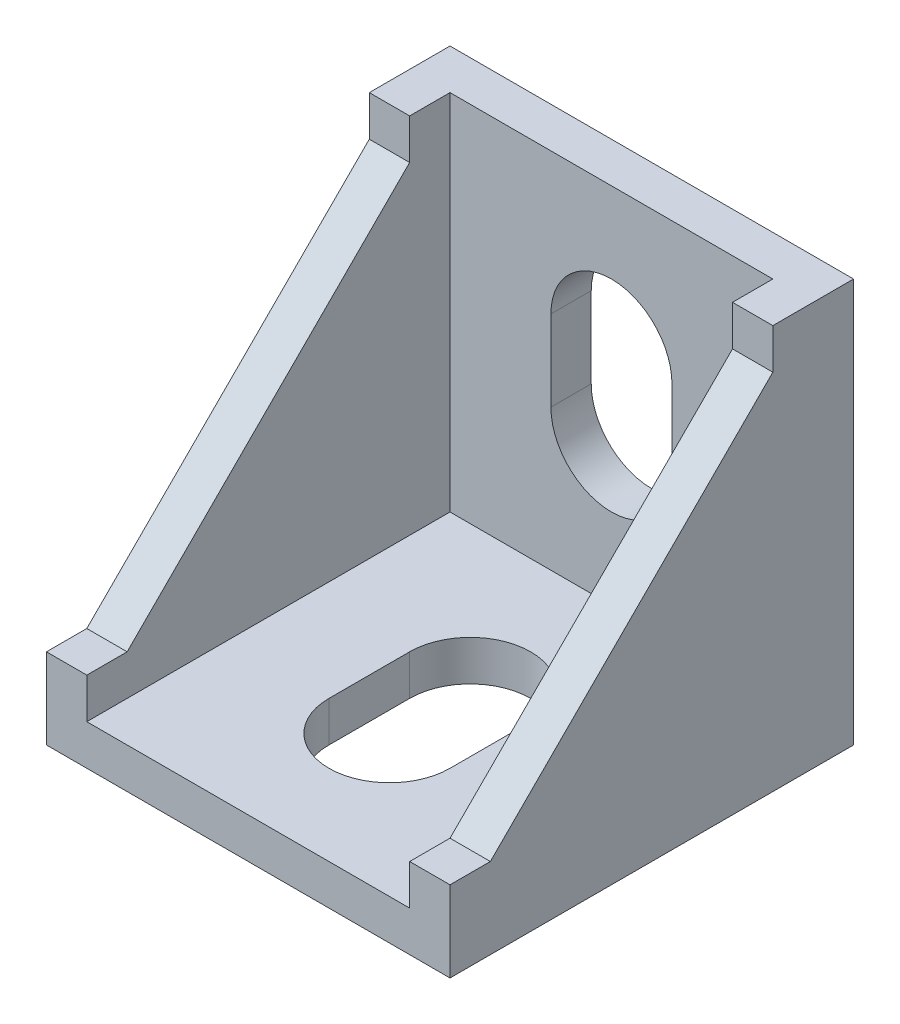
ISO-10303-21;
HEADER;
FILE_DESCRIPTION(('STEP AP214'),'2;1');
FILE_NAME('part.step','',(''),(''),'','','');
FILE_SCHEMA(('AUTOMOTIVE_DESIGN { 1 0 10303 214 1 1 1 1 }'));
ENDSEC;
DATA;
#1=APPLICATION_CONTEXT('core data for automotive mechanical design processes');
#2=APPLICATION_PROTOCOL_DEFINITION('international standard','automotive_design',2000,#1);
#3=PRODUCT_CONTEXT('',#1,'mechanical');
#4=PRODUCT('Part','Part','',(#3));
#5=PRODUCT_RELATED_PRODUCT_CATEGORY('part','',(#4));
#6=PRODUCT_DEFINITION_FORMATION('','',#4);
#7=PRODUCT_DEFINITION_CONTEXT('part definition',#1,'design');
#8=PRODUCT_DEFINITION('design','',#6,#7);
#9=PRODUCT_DEFINITION_SHAPE('','',#8);
#10=(LENGTH_UNIT() NAMED_UNIT(*) SI_UNIT(.MILLI.,.METRE.));
#11=(NAMED_UNIT(*) PLANE_ANGLE_UNIT() SI_UNIT($,.RADIAN.));
#12=(NAMED_UNIT(*) SI_UNIT($,.STERADIAN.) SOLID_ANGLE_UNIT());
#13=UNCERTAINTY_MEASURE_WITH_UNIT(LENGTH_MEASURE(1.E-05),#10,'distance_accuracy_value','');
#14=(GEOMETRIC_REPRESENTATION_CONTEXT(3) GLOBAL_UNCERTAINTY_ASSIGNED_CONTEXT((#13)) GLOBAL_UNIT_ASSIGNED_CONTEXT((#10,
#11,#12)) REPRESENTATION_CONTEXT('',''));
#15=CARTESIAN_POINT('',(0.,0.,0.));
#16=DIRECTION('',(0.,0.,1.));
#17=DIRECTION('',(1.,0.,0.));
#18=AXIS2_PLACEMENT_3D('',#15,#16,#17);
#19=CARTESIAN_POINT('',(0.,2.,0.));
#20=DIRECTION('',(0.,-1.,0.));
#21=DIRECTION('',(0.,0.,-1.));
#22=AXIS2_PLACEMENT_3D('',#19,#20,#21);
#23=PLANE('',#22);
#24=DIRECTION('',(0.,0.,-1.));
#25=VECTOR('',#24,1.);
#26=CARTESIAN_POINT('',(-3.,2.,0.));
#27=LINE('',#26,#25);
#28=CARTESIAN_POINT('',(-3.,2.,3.));
#29=VERTEX_POINT('',#28);
#30=CARTESIAN_POINT('',(-3.,2.,-1.));
#31=VERTEX_POINT('',#30);
#32=EDGE_CURVE('E230',#29,#31,#27,.T.);
#33=ORIENTED_EDGE('',*,*,#32,.T.);
#34=CARTESIAN_POINT('',(0.,2.,-1.));
#35=DIRECTION('',(0.,-1.,0.));
#36=DIRECTION('',(0.,0.,-1.));
#37=AXIS2_PLACEMENT_3D('',#34,#35,#36);
#38=CIRCLE('',#37,3.);
#39=CARTESIAN_POINT('',(3.,2.,-1.));
#40=VERTEX_POINT('',#39);
#41=EDGE_CURVE('E246',#31,#40,#38,.T.);
#42=ORIENTED_EDGE('',*,*,#41,.T.);
#43=DIRECTION('',(0.,0.,1.));
#44=VECTOR('',#43,1.);
#45=CARTESIAN_POINT('',(3.,2.,0.));
#46=LINE('',#45,#44);
#47=CARTESIAN_POINT('',(3.,2.,3.));
#48=VERTEX_POINT('',#47);
#49=EDGE_CURVE('E243',#40,#48,#46,.T.);
#50=ORIENTED_EDGE('',*,*,#49,.T.);
#51=CARTESIAN_POINT('',(0.,2.,3.));
#52=DIRECTION('',(0.,-1.,0.));
#53=DIRECTION('',(0.,0.,-1.));
#54=AXIS2_PLACEMENT_3D('',#51,#52,#53);
#55=CIRCLE('',#54,3.);
#56=EDGE_CURVE('E240',#48,#29,#55,.T.);
#57=ORIENTED_EDGE('',*,*,#56,.T.);
#58=EDGE_LOOP('',(#33,#42,#50,#57));
#59=FACE_BOUND('',#58,.T.);
#60=DIRECTION('',(1.,0.,0.));
#61=VECTOR('',#60,1.);
#62=CARTESIAN_POINT('',(-10.,2.,10.));
#63=LINE('',#62,#61);
#64=CARTESIAN_POINT('',(-8.,2.,10.));
#65=VERTEX_POINT('',#64);
#66=CARTESIAN_POINT('',(8.,2.,10.));
#67=VERTEX_POINT('',#66);
#68=EDGE_CURVE('E340',#65,#67,#63,.T.);
#69=ORIENTED_EDGE('',*,*,#68,.T.);
#70=DIRECTION('',(0.,0.,-1.));
#71=VECTOR('',#70,1.);
#72=CARTESIAN_POINT('',(8.,2.,10.));
#73=LINE('',#72,#71);
#74=CARTESIAN_POINT('',(8.,2.,-8.00000000000001));
#75=VERTEX_POINT('',#74);
#76=EDGE_CURVE('E259',#67,#75,#73,.T.);
#77=ORIENTED_EDGE('',*,*,#76,.T.);
#78=DIRECTION('',(1.,0.,0.));
#79=VECTOR('',#78,1.);
#80=CARTESIAN_POINT('',(0.,2.,-8.));
#81=LINE('',#80,#79);
#82=CARTESIAN_POINT('',(-8.,2.,-8.00000000000001));
#83=VERTEX_POINT('',#82);
#84=EDGE_CURVE('E334',#83,#75,#81,.T.);
#85=ORIENTED_EDGE('',*,*,#84,.F.);
#86=DIRECTION('',(0.,0.,-1.));
#87=VECTOR('',#86,1.);
#88=CARTESIAN_POINT('',(-8.,2.,10.));
#89=LINE('',#88,#87);
#90=EDGE_CURVE('E299',#65,#83,#89,.T.);
#91=ORIENTED_EDGE('',*,*,#90,.F.);
#92=EDGE_LOOP('',(#69,#77,#85,#91));
#93=FACE_BOUND('',#92,.T.);
#94=ADVANCED_FACE('F38',(#59,#93),#23,.F.);
#95=CARTESIAN_POINT('',(10.,2.,10.));
#96=DIRECTION('',(-1.,0.,0.));
#97=DIRECTION('',(0.,0.,1.));
#98=AXIS2_PLACEMENT_3D('',#95,#96,#97);
#99=PLANE('',#98);
#100=DIRECTION('',(0.,-1.,0.));
#101=VECTOR('',#100,1.);
#102=CARTESIAN_POINT('',(10.,2.,-10.));
#103=LINE('',#102,#101);
#104=CARTESIAN_POINT('',(10.,20.,-10.));
#105=VERTEX_POINT('',#104);
#106=CARTESIAN_POINT('',(10.,0.,-10.));
#107=VERTEX_POINT('',#106);
#108=EDGE_CURVE('E359',#105,#107,#103,.T.);
#109=ORIENTED_EDGE('',*,*,#108,.F.);
#110=DIRECTION('',(0.,0.,-1.));
#111=VECTOR('',#110,1.);
#112=CARTESIAN_POINT('',(10.,20.,-8.));
#113=LINE('',#112,#111);
#114=CARTESIAN_POINT('',(10.,20.,-6.));
#115=VERTEX_POINT('',#114);
#116=EDGE_CURVE('E331',#115,#105,#113,.T.);
#117=ORIENTED_EDGE('',*,*,#116,.F.);
#118=DIRECTION('',(0.,-1.,0.));
#119=VECTOR('',#118,1.);
#120=CARTESIAN_POINT('',(10.,20.,-6.));
#121=LINE('',#120,#119);
#122=CARTESIAN_POINT('',(10.,18.,-6.));
#123=VERTEX_POINT('',#122);
#124=EDGE_CURVE('E249',#115,#123,#121,.T.);
#125=ORIENTED_EDGE('',*,*,#124,.T.);
#126=DIRECTION('',(0.,-0.707106781186548,0.707106781186547));
#127=VECTOR('',#126,1.);
#128=CARTESIAN_POINT('',(10.,18.,-6.));
#129=LINE('',#128,#127);
#130=CARTESIAN_POINT('',(10.,4.,7.99999999999999));
#131=VERTEX_POINT('',#130);
#132=EDGE_CURVE('E254',#123,#131,#129,.T.);
#133=ORIENTED_EDGE('',*,*,#132,.T.);
#134=DIRECTION('',(0.,0.,-1.));
#135=VECTOR('',#134,1.);
#136=CARTESIAN_POINT('',(10.,4.,10.));
#137=LINE('',#136,#135);
#138=CARTESIAN_POINT('',(10.,4.,10.));
#139=VERTEX_POINT('',#138);
#140=EDGE_CURVE('E272',#139,#131,#137,.T.);
#141=ORIENTED_EDGE('',*,*,#140,.F.);
#142=DIRECTION('',(0.,-1.,0.));
#143=VECTOR('',#142,1.);
#144=CARTESIAN_POINT('',(10.,2.,10.));
#145=LINE('',#144,#143);
#146=CARTESIAN_POINT('',(10.,0.,10.));
#147=VERTEX_POINT('',#146);
#148=EDGE_CURVE('E343',#139,#147,#145,.T.);
#149=ORIENTED_EDGE('',*,*,#148,.T.);
#150=DIRECTION('',(0.,0.,-1.));
#151=VECTOR('',#150,1.);
#152=CARTESIAN_POINT('',(10.,0.,10.));
#153=LINE('',#152,#151);
#154=EDGE_CURVE('E339',#147,#107,#153,.T.);
#155=ORIENTED_EDGE('',*,*,#154,.T.);
#156=EDGE_LOOP('',(#109,#117,#125,#133,#141,#149,#155));
#157=FACE_BOUND('',#156,.T.);
#158=ADVANCED_FACE('F40',(#157),#99,.F.);
#159=CARTESIAN_POINT('',(-10.,2.,-10.));
#160=DIRECTION('',(0.,0.,1.));
#161=DIRECTION('',(1.,0.,0.));
#162=AXIS2_PLACEMENT_3D('',#159,#160,#161);
#163=PLANE('',#162);
#164=DIRECTION('',(0.,1.,0.));
#165=VECTOR('',#164,1.);
#166=CARTESIAN_POINT('',(3.,13.,-10.));
#167=LINE('',#166,#165);
#168=CARTESIAN_POINT('',(3.,9.,-10.));
#169=VERTEX_POINT('',#168);
#170=CARTESIAN_POINT('',(3.,13.,-10.));
#171=VERTEX_POINT('',#170);
#172=EDGE_CURVE('E194',#169,#171,#167,.T.);
#173=ORIENTED_EDGE('',*,*,#172,.T.);
#174=CARTESIAN_POINT('',(0.,13.,-10.));
#175=DIRECTION('',(0.,0.,1.));
#176=DIRECTION('',(1.,0.,0.));
#177=AXIS2_PLACEMENT_3D('',#174,#175,#176);
#178=CIRCLE('',#177,3.);
#179=CARTESIAN_POINT('',(-3.,13.,-10.));
#180=VERTEX_POINT('',#179);
#181=EDGE_CURVE('E190',#171,#180,#178,.T.);
#182=ORIENTED_EDGE('',*,*,#181,.T.);
#183=DIRECTION('',(0.,-1.,0.));
#184=VECTOR('',#183,1.);
#185=CARTESIAN_POINT('',(-3.,13.,-10.));
#186=LINE('',#185,#184);
#187=CARTESIAN_POINT('',(-3.,9.,-10.));
#188=VERTEX_POINT('',#187);
#189=EDGE_CURVE('E197',#180,#188,#186,.T.);
#190=ORIENTED_EDGE('',*,*,#189,.T.);
#191=CARTESIAN_POINT('',(0.,9.,-10.));
#192=DIRECTION('',(0.,0.,1.));
#193=DIRECTION('',(1.,0.,0.));
#194=AXIS2_PLACEMENT_3D('',#191,#192,#193);
#195=CIRCLE('',#194,3.);
#196=EDGE_CURVE('E53',#188,#169,#195,.T.);
#197=ORIENTED_EDGE('',*,*,#196,.T.);
#198=EDGE_LOOP('',(#173,#182,#190,#197));
#199=FACE_BOUND('',#198,.T.);
#200=DIRECTION('',(-1.,0.,0.));
#201=VECTOR('',#200,1.);
#202=CARTESIAN_POINT('',(-10.,0.,-10.));
#203=LINE('',#202,#201);
#204=CARTESIAN_POINT('',(-10.,0.,-10.));
#205=VERTEX_POINT('',#204);
#206=EDGE_CURVE('E346',#107,#205,#203,.T.);
#207=ORIENTED_EDGE('',*,*,#206,.T.);
#208=DIRECTION('',(0.,-1.,0.));
#209=VECTOR('',#208,1.);
#210=CARTESIAN_POINT('',(-10.,2.,-10.));
#211=LINE('',#210,#209);
#212=CARTESIAN_POINT('',(-10.,20.,-10.));
#213=VERTEX_POINT('',#212);
#214=EDGE_CURVE('E356',#213,#205,#211,.T.);
#215=ORIENTED_EDGE('',*,*,#214,.F.);
#216=DIRECTION('',(1.,0.,0.));
#217=VECTOR('',#216,1.);
#218=CARTESIAN_POINT('',(-10.,20.,-10.));
#219=LINE('',#218,#217);
#220=EDGE_CURVE('E324',#213,#105,#219,.T.);
#221=ORIENTED_EDGE('',*,*,#220,.T.);
#222=ORIENTED_EDGE('',*,*,#108,.T.);
#223=EDGE_LOOP('',(#207,#215,#221,#222));
#224=FACE_BOUND('',#223,.T.);
#225=ADVANCED_FACE('F201',(#199,#224),#163,.F.);
#226=CARTESIAN_POINT('',(-10.,2.,10.));
#227=DIRECTION('',(1.,0.,0.));
#228=DIRECTION('',(0.,0.,-1.));
#229=AXIS2_PLACEMENT_3D('',#226,#227,#228);
#230=PLANE('',#229);
#231=DIRECTION('',(0.,-1.,0.));
#232=VECTOR('',#231,1.);
#233=CARTESIAN_POINT('',(-10.,2.,10.));
#234=LINE('',#233,#232);
#235=CARTESIAN_POINT('',(-10.,4.,10.));
#236=VERTEX_POINT('',#235);
#237=CARTESIAN_POINT('',(-10.,0.,10.));
#238=VERTEX_POINT('',#237);
#239=EDGE_CURVE('E353',#236,#238,#234,.T.);
#240=ORIENTED_EDGE('',*,*,#239,.F.);
#241=DIRECTION('',(0.,0.,-1.));
#242=VECTOR('',#241,1.);
#243=CARTESIAN_POINT('',(-10.,4.,10.));
#244=LINE('',#243,#242);
#245=CARTESIAN_POINT('',(-10.,4.,7.99999999999999));
#246=VERTEX_POINT('',#245);
#247=EDGE_CURVE('E291',#236,#246,#244,.T.);
#248=ORIENTED_EDGE('',*,*,#247,.T.);
#249=DIRECTION('',(0.,-0.707106781186548,0.707106781186547));
#250=VECTOR('',#249,1.);
#251=CARTESIAN_POINT('',(-10.,18.,-6.));
#252=LINE('',#251,#250);
#253=CARTESIAN_POINT('',(-10.,18.,-6.));
#254=VERTEX_POINT('',#253);
#255=EDGE_CURVE('E309',#254,#246,#252,.T.);
#256=ORIENTED_EDGE('',*,*,#255,.F.);
#257=DIRECTION('',(0.,-1.,0.));
#258=VECTOR('',#257,1.);
#259=CARTESIAN_POINT('',(-10.,20.,-6.));
#260=LINE('',#259,#258);
#261=CARTESIAN_POINT('',(-10.,20.,-6.));
#262=VERTEX_POINT('',#261);
#263=EDGE_CURVE('E286',#262,#254,#260,.T.);
#264=ORIENTED_EDGE('',*,*,#263,.F.);
#265=DIRECTION('',(0.,0.,-1.));
#266=VECTOR('',#265,1.);
#267=CARTESIAN_POINT('',(-10.,20.,-8.));
#268=LINE('',#267,#266);
#269=EDGE_CURVE('E328',#262,#213,#268,.T.);
#270=ORIENTED_EDGE('',*,*,#269,.T.);
#271=ORIENTED_EDGE('',*,*,#214,.T.);
#272=DIRECTION('',(0.,0.,1.));
#273=VECTOR('',#272,1.);
#274=CARTESIAN_POINT('',(-10.,0.,10.));
#275=LINE('',#274,#273);
#276=EDGE_CURVE('E348',#205,#238,#275,.T.);
#277=ORIENTED_EDGE('',*,*,#276,.T.);
#278=EDGE_LOOP('',(#240,#248,#256,#264,#270,#271,#277));
#279=FACE_BOUND('',#278,.T.);
#280=ADVANCED_FACE('F400',(#279),#230,.F.);
#281=CARTESIAN_POINT('',(-10.,2.,10.));
#282=DIRECTION('',(0.,0.,-1.));
#283=DIRECTION('',(-1.,0.,0.));
#284=AXIS2_PLACEMENT_3D('',#281,#282,#283);
#285=PLANE('',#284);
#286=DIRECTION('',(1.,0.,0.));
#287=VECTOR('',#286,1.);
#288=CARTESIAN_POINT('',(-10.,0.,10.));
#289=LINE('',#288,#287);
#290=EDGE_CURVE('E344',#238,#147,#289,.T.);
#291=ORIENTED_EDGE('',*,*,#290,.T.);
#292=ORIENTED_EDGE('',*,*,#148,.F.);
#293=DIRECTION('',(1.,0.,0.));
#294=VECTOR('',#293,1.);
#295=CARTESIAN_POINT('',(8.,4.,10.));
#296=LINE('',#295,#294);
#297=CARTESIAN_POINT('',(8.,4.,10.));
#298=VERTEX_POINT('',#297);
#299=EDGE_CURVE('E280',#298,#139,#296,.T.);
#300=ORIENTED_EDGE('',*,*,#299,.F.);
#301=DIRECTION('',(0.,1.,0.));
#302=VECTOR('',#301,1.);
#303=CARTESIAN_POINT('',(8.,2.,10.));
#304=LINE('',#303,#302);
#305=EDGE_CURVE('E262',#67,#298,#304,.T.);
#306=ORIENTED_EDGE('',*,*,#305,.F.);
#307=ORIENTED_EDGE('',*,*,#68,.F.);
#308=DIRECTION('',(0.,1.,0.));
#309=VECTOR('',#308,1.);
#310=CARTESIAN_POINT('',(-8.,2.,10.));
#311=LINE('',#310,#309);
#312=CARTESIAN_POINT('',(-8.,4.,10.));
#313=VERTEX_POINT('',#312);
#314=EDGE_CURVE('E296',#65,#313,#311,.T.);
#315=ORIENTED_EDGE('',*,*,#314,.T.);
#316=DIRECTION('',(-1.,0.,0.));
#317=VECTOR('',#316,1.);
#318=CARTESIAN_POINT('',(-8.,4.,10.));
#319=LINE('',#318,#317);
#320=EDGE_CURVE('E316',#313,#236,#319,.T.);
#321=ORIENTED_EDGE('',*,*,#320,.T.);
#322=ORIENTED_EDGE('',*,*,#239,.T.);
#323=EDGE_LOOP('',(#291,#292,#300,#306,#307,#315,#321,#322));
#324=FACE_BOUND('',#323,.T.);
#325=ADVANCED_FACE('F396',(#324),#285,.F.);
#326=CARTESIAN_POINT('',(0.,0.,0.));
#327=DIRECTION('',(0.,-1.,0.));
#328=DIRECTION('',(0.,0.,-1.));
#329=AXIS2_PLACEMENT_3D('',#326,#327,#328);
#330=PLANE('',#329);
#331=CARTESIAN_POINT('',(0.,0.,-1.));
#332=DIRECTION('',(0.,1.,0.));
#333=DIRECTION('',(0.,0.,1.));
#334=AXIS2_PLACEMENT_3D('',#331,#332,#333);
#335=CIRCLE('',#334,3.);
#336=CARTESIAN_POINT('',(3.,0.,-1.));
#337=VERTEX_POINT('',#336);
#338=CARTESIAN_POINT('',(-3.,0.,-1.));
#339=VERTEX_POINT('',#338);
#340=EDGE_CURVE('E210',#337,#339,#335,.T.);
#341=ORIENTED_EDGE('',*,*,#340,.T.);
#342=DIRECTION('',(0.,0.,1.));
#343=VECTOR('',#342,1.);
#344=CARTESIAN_POINT('',(-3.,0.,-1.));
#345=LINE('',#344,#343);
#346=CARTESIAN_POINT('',(-3.,0.,3.));
#347=VERTEX_POINT('',#346);
#348=EDGE_CURVE('E217',#339,#347,#345,.T.);
#349=ORIENTED_EDGE('',*,*,#348,.T.);
#350=CARTESIAN_POINT('',(0.,0.,3.));
#351=DIRECTION('',(0.,1.,0.));
#352=DIRECTION('',(0.,0.,1.));
#353=AXIS2_PLACEMENT_3D('',#350,#351,#352);
#354=CIRCLE('',#353,3.);
#355=CARTESIAN_POINT('',(3.,0.,3.));
#356=VERTEX_POINT('',#355);
#357=EDGE_CURVE('E220',#347,#356,#354,.T.);
#358=ORIENTED_EDGE('',*,*,#357,.T.);
#359=DIRECTION('',(0.,0.,-1.));
#360=VECTOR('',#359,1.);
#361=CARTESIAN_POINT('',(3.,0.,-1.));
#362=LINE('',#361,#360);
#363=EDGE_CURVE('E223',#356,#337,#362,.T.);
#364=ORIENTED_EDGE('',*,*,#363,.T.);
#365=EDGE_LOOP('',(#341,#349,#358,#364));
#366=FACE_BOUND('',#365,.T.);
#367=ORIENTED_EDGE('',*,*,#206,.F.);
#368=ORIENTED_EDGE('',*,*,#154,.F.);
#369=ORIENTED_EDGE('',*,*,#290,.F.);
#370=ORIENTED_EDGE('',*,*,#276,.F.);
#371=EDGE_LOOP('',(#367,#368,#369,#370));
#372=FACE_BOUND('',#371,.T.);
#373=ADVANCED_FACE('F393',(#366,#372),#330,.T.);
#374=CARTESIAN_POINT('',(0.,0.,-8.));
#375=DIRECTION('',(0.,0.,-1.));
#376=DIRECTION('',(-1.,0.,0.));
#377=AXIS2_PLACEMENT_3D('',#374,#375,#376);
#378=PLANE('',#377);
#379=DIRECTION('',(0.,1.,0.));
#380=VECTOR('',#379,1.);
#381=CARTESIAN_POINT('',(-3.,0.,-8.));
#382=LINE('',#381,#380);
#383=CARTESIAN_POINT('',(-3.,9.,-8.));
#384=VERTEX_POINT('',#383);
#385=CARTESIAN_POINT('',(-3.,13.,-8.));
#386=VERTEX_POINT('',#385);
#387=EDGE_CURVE('E362',#384,#386,#382,.T.);
#388=ORIENTED_EDGE('',*,*,#387,.T.);
#389=CARTESIAN_POINT('',(0.,13.,-8.));
#390=DIRECTION('',(0.,0.,-1.));
#391=DIRECTION('',(-1.,0.,0.));
#392=AXIS2_PLACEMENT_3D('',#389,#390,#391);
#393=CIRCLE('',#392,3.);
#394=CARTESIAN_POINT('',(3.,13.,-8.));
#395=VERTEX_POINT('',#394);
#396=EDGE_CURVE('E11',#386,#395,#393,.T.);
#397=ORIENTED_EDGE('',*,*,#396,.T.);
#398=DIRECTION('',(0.,-1.,0.));
#399=VECTOR('',#398,1.);
#400=CARTESIAN_POINT('',(3.,0.,-8.));
#401=LINE('',#400,#399);
#402=CARTESIAN_POINT('',(3.,9.,-8.));
#403=VERTEX_POINT('',#402);
#404=EDGE_CURVE('E46',#395,#403,#401,.T.);
#405=ORIENTED_EDGE('',*,*,#404,.T.);
#406=CARTESIAN_POINT('',(0.,9.,-8.));
#407=DIRECTION('',(0.,0.,-1.));
#408=DIRECTION('',(-1.,0.,0.));
#409=AXIS2_PLACEMENT_3D('',#406,#407,#408);
#410=CIRCLE('',#409,3.);
#411=EDGE_CURVE('E364',#403,#384,#410,.T.);
#412=ORIENTED_EDGE('',*,*,#411,.T.);
#413=EDGE_LOOP('',(#388,#397,#405,#412));
#414=FACE_BOUND('',#413,.T.);
#415=ORIENTED_EDGE('',*,*,#84,.T.);
#416=DIRECTION('',(0.,-1.,0.));
#417=VECTOR('',#416,1.);
#418=CARTESIAN_POINT('',(8.,20.,-8.));
#419=LINE('',#418,#417);
#420=CARTESIAN_POINT('',(8.,20.,-8.));
#421=VERTEX_POINT('',#420);
#422=EDGE_CURVE('E257',#421,#75,#419,.T.);
#423=ORIENTED_EDGE('',*,*,#422,.F.);
#424=DIRECTION('',(1.,0.,0.));
#425=VECTOR('',#424,1.);
#426=CARTESIAN_POINT('',(-10.,20.,-8.));
#427=LINE('',#426,#425);
#428=CARTESIAN_POINT('',(-8.,20.,-8.));
#429=VERTEX_POINT('',#428);
#430=EDGE_CURVE('E325',#429,#421,#427,.T.);
#431=ORIENTED_EDGE('',*,*,#430,.F.);
#432=DIRECTION('',(0.,-1.,0.));
#433=VECTOR('',#432,1.);
#434=CARTESIAN_POINT('',(-8.,20.,-8.));
#435=LINE('',#434,#433);
#436=EDGE_CURVE('E301',#429,#83,#435,.T.);
#437=ORIENTED_EDGE('',*,*,#436,.T.);
#438=EDGE_LOOP('',(#415,#423,#431,#437));
#439=FACE_BOUND('',#438,.T.);
#440=ADVANCED_FACE('F368',(#414,#439),#378,.F.);
#441=CARTESIAN_POINT('',(-10.,20.,-8.));
#442=DIRECTION('',(0.,1.,0.));
#443=DIRECTION('',(0.,0.,1.));
#444=AXIS2_PLACEMENT_3D('',#441,#442,#443);
#445=PLANE('',#444);
#446=ORIENTED_EDGE('',*,*,#220,.F.);
#447=ORIENTED_EDGE('',*,*,#269,.F.);
#448=DIRECTION('',(-1.,0.,0.));
#449=VECTOR('',#448,1.);
#450=CARTESIAN_POINT('',(-8.,20.,-6.));
#451=LINE('',#450,#449);
#452=CARTESIAN_POINT('',(-8.,20.,-6.));
#453=VERTEX_POINT('',#452);
#454=EDGE_CURVE('E306',#453,#262,#451,.T.);
#455=ORIENTED_EDGE('',*,*,#454,.F.);
#456=DIRECTION('',(0.,0.,1.));
#457=VECTOR('',#456,1.);
#458=CARTESIAN_POINT('',(-8.,20.,-8.));
#459=LINE('',#458,#457);
#460=EDGE_CURVE('E304',#429,#453,#459,.T.);
#461=ORIENTED_EDGE('',*,*,#460,.F.);
#462=ORIENTED_EDGE('',*,*,#430,.T.);
#463=DIRECTION('',(0.,0.,1.));
#464=VECTOR('',#463,1.);
#465=CARTESIAN_POINT('',(8.,20.,-8.));
#466=LINE('',#465,#464);
#467=CARTESIAN_POINT('',(8.,20.,-6.));
#468=VERTEX_POINT('',#467);
#469=EDGE_CURVE('E253',#421,#468,#466,.T.);
#470=ORIENTED_EDGE('',*,*,#469,.T.);
#471=DIRECTION('',(1.,0.,0.));
#472=VECTOR('',#471,1.);
#473=CARTESIAN_POINT('',(8.,20.,-6.));
#474=LINE('',#473,#472);
#475=EDGE_CURVE('E283',#468,#115,#474,.T.);
#476=ORIENTED_EDGE('',*,*,#475,.T.);
#477=ORIENTED_EDGE('',*,*,#116,.T.);
#478=EDGE_LOOP('',(#446,#447,#455,#461,#462,#470,#476,#477));
#479=FACE_BOUND('',#478,.T.);
#480=ADVANCED_FACE('F391',(#479),#445,.T.);
#481=CARTESIAN_POINT('',(-8.,20.,-6.));
#482=DIRECTION('',(0.,0.,-1.));
#483=DIRECTION('',(-1.,0.,0.));
#484=AXIS2_PLACEMENT_3D('',#481,#482,#483);
#485=PLANE('',#484);
#486=ORIENTED_EDGE('',*,*,#263,.T.);
#487=DIRECTION('',(-1.,0.,0.));
#488=VECTOR('',#487,1.);
#489=CARTESIAN_POINT('',(-8.,18.,-6.));
#490=LINE('',#489,#488);
#491=CARTESIAN_POINT('',(-8.,18.,-6.));
#492=VERTEX_POINT('',#491);
#493=EDGE_CURVE('E321',#492,#254,#490,.T.);
#494=ORIENTED_EDGE('',*,*,#493,.F.);
#495=DIRECTION('',(0.,-1.,0.));
#496=VECTOR('',#495,1.);
#497=CARTESIAN_POINT('',(-8.,20.,-6.));
#498=LINE('',#497,#496);
#499=EDGE_CURVE('E287',#453,#492,#498,.T.);
#500=ORIENTED_EDGE('',*,*,#499,.F.);
#501=ORIENTED_EDGE('',*,*,#454,.T.);
#502=EDGE_LOOP('',(#486,#494,#500,#501));
#503=FACE_BOUND('',#502,.T.);
#504=ADVANCED_FACE('F428',(#503),#485,.F.);
#505=CARTESIAN_POINT('',(-8.,18.,-6.));
#506=DIRECTION('',(0.,-0.707106781186547,-0.707106781186548));
#507=DIRECTION('',(0.,0.707106781186548,-0.707106781186547));
#508=AXIS2_PLACEMENT_3D('',#505,#506,#507);
#509=PLANE('',#508);
#510=ORIENTED_EDGE('',*,*,#255,.T.);
#511=DIRECTION('',(-1.,0.,0.));
#512=VECTOR('',#511,1.);
#513=CARTESIAN_POINT('',(-8.,4.,7.99999999999999));
#514=LINE('',#513,#512);
#515=CARTESIAN_POINT('',(-8.,4.,7.99999999999999));
#516=VERTEX_POINT('',#515);
#517=EDGE_CURVE('E319',#516,#246,#514,.T.);
#518=ORIENTED_EDGE('',*,*,#517,.F.);
#519=DIRECTION('',(0.,-0.707106781186548,0.707106781186547));
#520=VECTOR('',#519,1.);
#521=CARTESIAN_POINT('',(-8.,18.,-6.));
#522=LINE('',#521,#520);
#523=EDGE_CURVE('E290',#492,#516,#522,.T.);
#524=ORIENTED_EDGE('',*,*,#523,.F.);
#525=ORIENTED_EDGE('',*,*,#493,.T.);
#526=EDGE_LOOP('',(#510,#518,#524,#525));
#527=FACE_BOUND('',#526,.T.);
#528=ADVANCED_FACE('F435',(#527),#509,.F.);
#529=CARTESIAN_POINT('',(-8.,4.,10.));
#530=DIRECTION('',(0.,1.,0.));
#531=DIRECTION('',(0.,0.,1.));
#532=AXIS2_PLACEMENT_3D('',#529,#530,#531);
#533=PLANE('',#532);
#534=ORIENTED_EDGE('',*,*,#247,.F.);
#535=ORIENTED_EDGE('',*,*,#320,.F.);
#536=DIRECTION('',(0.,0.,-1.));
#537=VECTOR('',#536,1.);
#538=CARTESIAN_POINT('',(-8.,4.,10.));
#539=LINE('',#538,#537);
#540=EDGE_CURVE('E293',#313,#516,#539,.T.);
#541=ORIENTED_EDGE('',*,*,#540,.T.);
#542=ORIENTED_EDGE('',*,*,#517,.T.);
#543=EDGE_LOOP('',(#534,#535,#541,#542));
#544=FACE_BOUND('',#543,.T.);
#545=ADVANCED_FACE('F442',(#544),#533,.T.);
#546=CARTESIAN_POINT('',(-8.,0.,0.));
#547=DIRECTION('',(1.,0.,0.));
#548=DIRECTION('',(0.,0.,-1.));
#549=AXIS2_PLACEMENT_3D('',#546,#547,#548);
#550=PLANE('',#549);
#551=ORIENTED_EDGE('',*,*,#499,.T.);
#552=ORIENTED_EDGE('',*,*,#523,.T.);
#553=ORIENTED_EDGE('',*,*,#540,.F.);
#554=ORIENTED_EDGE('',*,*,#314,.F.);
#555=ORIENTED_EDGE('',*,*,#90,.T.);
#556=ORIENTED_EDGE('',*,*,#436,.F.);
#557=ORIENTED_EDGE('',*,*,#460,.T.);
#558=EDGE_LOOP('',(#551,#552,#553,#554,#555,#556,#557));
#559=FACE_BOUND('',#558,.T.);
#560=ADVANCED_FACE('F449',(#559),#550,.T.);
#561=CARTESIAN_POINT('',(8.,20.,-6.));
#562=DIRECTION('',(0.,0.,1.));
#563=DIRECTION('',(1.,0.,0.));
#564=AXIS2_PLACEMENT_3D('',#561,#562,#563);
#565=PLANE('',#564);
#566=ORIENTED_EDGE('',*,*,#124,.F.);
#567=ORIENTED_EDGE('',*,*,#475,.F.);
#568=DIRECTION('',(0.,-1.,0.));
#569=VECTOR('',#568,1.);
#570=CARTESIAN_POINT('',(8.,20.,-6.));
#571=LINE('',#570,#569);
#572=CARTESIAN_POINT('',(8.,18.,-6.));
#573=VERTEX_POINT('',#572);
#574=EDGE_CURVE('E250',#468,#573,#571,.T.);
#575=ORIENTED_EDGE('',*,*,#574,.T.);
#576=DIRECTION('',(1.,0.,0.));
#577=VECTOR('',#576,1.);
#578=CARTESIAN_POINT('',(8.,18.,-6.));
#579=LINE('',#578,#577);
#580=EDGE_CURVE('E269',#573,#123,#579,.T.);
#581=ORIENTED_EDGE('',*,*,#580,.T.);
#582=EDGE_LOOP('',(#566,#567,#575,#581));
#583=FACE_BOUND('',#582,.T.);
#584=ADVANCED_FACE('F455',(#583),#565,.T.);
#585=CARTESIAN_POINT('',(8.,4.,10.));
#586=DIRECTION('',(0.,-1.,0.));
#587=DIRECTION('',(0.,0.,-1.));
#588=AXIS2_PLACEMENT_3D('',#585,#586,#587);
#589=PLANE('',#588);
#590=ORIENTED_EDGE('',*,*,#140,.T.);
#591=DIRECTION('',(1.,0.,0.));
#592=VECTOR('',#591,1.);
#593=CARTESIAN_POINT('',(8.,4.,7.99999999999999));
#594=LINE('',#593,#592);
#595=CARTESIAN_POINT('',(8.,4.,7.99999999999999));
#596=VERTEX_POINT('',#595);
#597=EDGE_CURVE('E278',#596,#131,#594,.T.);
#598=ORIENTED_EDGE('',*,*,#597,.F.);
#599=DIRECTION('',(0.,0.,-1.));
#600=VECTOR('',#599,1.);
#601=CARTESIAN_POINT('',(8.,4.,10.));
#602=LINE('',#601,#600);
#603=EDGE_CURVE('E264',#298,#596,#602,.T.);
#604=ORIENTED_EDGE('',*,*,#603,.F.);
#605=ORIENTED_EDGE('',*,*,#299,.T.);
#606=EDGE_LOOP('',(#590,#598,#604,#605));
#607=FACE_BOUND('',#606,.T.);
#608=ADVANCED_FACE('F463',(#607),#589,.F.);
#609=CARTESIAN_POINT('',(8.,18.,-6.));
#610=DIRECTION('',(0.,0.707106781186547,0.707106781186548));
#611=DIRECTION('',(0.,-0.707106781186548,0.707106781186547));
#612=AXIS2_PLACEMENT_3D('',#609,#610,#611);
#613=PLANE('',#612);
#614=ORIENTED_EDGE('',*,*,#132,.F.);
#615=ORIENTED_EDGE('',*,*,#580,.F.);
#616=DIRECTION('',(0.,-0.707106781186548,0.707106781186547));
#617=VECTOR('',#616,1.);
#618=CARTESIAN_POINT('',(8.,18.,-6.));
#619=LINE('',#618,#617);
#620=EDGE_CURVE('E266',#573,#596,#619,.T.);
#621=ORIENTED_EDGE('',*,*,#620,.T.);
#622=ORIENTED_EDGE('',*,*,#597,.T.);
#623=EDGE_LOOP('',(#614,#615,#621,#622));
#624=FACE_BOUND('',#623,.T.);
#625=ADVANCED_FACE('F470',(#624),#613,.T.);
#626=CARTESIAN_POINT('',(8.,0.,0.));
#627=DIRECTION('',(-1.,0.,0.));
#628=DIRECTION('',(0.,0.,-1.));
#629=AXIS2_PLACEMENT_3D('',#626,#627,#628);
#630=PLANE('',#629);
#631=ORIENTED_EDGE('',*,*,#574,.F.);
#632=ORIENTED_EDGE('',*,*,#469,.F.);
#633=ORIENTED_EDGE('',*,*,#422,.T.);
#634=ORIENTED_EDGE('',*,*,#76,.F.);
#635=ORIENTED_EDGE('',*,*,#305,.T.);
#636=ORIENTED_EDGE('',*,*,#603,.T.);
#637=ORIENTED_EDGE('',*,*,#620,.F.);
#638=EDGE_LOOP('',(#631,#632,#633,#634,#635,#636,#637));
#639=FACE_BOUND('',#638,.T.);
#640=ADVANCED_FACE('F477',(#639),#630,.T.);
#641=CARTESIAN_POINT('',(0.,0.,-1.));
#642=DIRECTION('',(0.,1.,0.));
#643=DIRECTION('',(0.,0.,1.));
#644=AXIS2_PLACEMENT_3D('',#641,#642,#643);
#645=CYLINDRICAL_SURFACE('',#644,3.);
#646=DIRECTION('',(0.,1.,0.));
#647=VECTOR('',#646,1.);
#648=CARTESIAN_POINT('',(-3.,0.,-1.));
#649=LINE('',#648,#647);
#650=EDGE_CURVE('E226',#339,#31,#649,.T.);
#651=ORIENTED_EDGE('',*,*,#650,.F.);
#652=ORIENTED_EDGE('',*,*,#340,.F.);
#653=DIRECTION('',(0.,1.,0.));
#654=VECTOR('',#653,1.);
#655=CARTESIAN_POINT('',(3.,0.,-1.));
#656=LINE('',#655,#654);
#657=EDGE_CURVE('E227',#337,#40,#656,.T.);
#658=ORIENTED_EDGE('',*,*,#657,.T.);
#659=ORIENTED_EDGE('',*,*,#41,.F.);
#660=EDGE_LOOP('',(#651,#652,#658,#659));
#661=FACE_BOUND('',#660,.T.);
#662=ADVANCED_FACE('F484',(#661),#645,.F.);
#663=CARTESIAN_POINT('',(3.,0.,-1.));
#664=DIRECTION('',(1.,0.,0.));
#665=DIRECTION('',(0.,0.,-1.));
#666=AXIS2_PLACEMENT_3D('',#663,#664,#665);
#667=PLANE('',#666);
#668=ORIENTED_EDGE('',*,*,#657,.F.);
#669=ORIENTED_EDGE('',*,*,#363,.F.);
#670=DIRECTION('',(0.,1.,0.));
#671=VECTOR('',#670,1.);
#672=CARTESIAN_POINT('',(3.,0.,3.));
#673=LINE('',#672,#671);
#674=EDGE_CURVE('E231',#356,#48,#673,.T.);
#675=ORIENTED_EDGE('',*,*,#674,.T.);
#676=ORIENTED_EDGE('',*,*,#49,.F.);
#677=EDGE_LOOP('',(#668,#669,#675,#676));
#678=FACE_BOUND('',#677,.T.);
#679=ADVANCED_FACE('F490',(#678),#667,.F.);
#680=CARTESIAN_POINT('',(0.,0.,3.));
#681=DIRECTION('',(0.,1.,0.));
#682=DIRECTION('',(0.,0.,1.));
#683=AXIS2_PLACEMENT_3D('',#680,#681,#682);
#684=CYLINDRICAL_SURFACE('',#683,3.);
#685=ORIENTED_EDGE('',*,*,#674,.F.);
#686=ORIENTED_EDGE('',*,*,#357,.F.);
#687=DIRECTION('',(0.,1.,0.));
#688=VECTOR('',#687,1.);
#689=CARTESIAN_POINT('',(-3.,0.,3.));
#690=LINE('',#689,#688);
#691=EDGE_CURVE('E234',#347,#29,#690,.T.);
#692=ORIENTED_EDGE('',*,*,#691,.T.);
#693=ORIENTED_EDGE('',*,*,#56,.F.);
#694=EDGE_LOOP('',(#685,#686,#692,#693));
#695=FACE_BOUND('',#694,.T.);
#696=ADVANCED_FACE('F497',(#695),#684,.F.);
#697=CARTESIAN_POINT('',(-3.,0.,-1.));
#698=DIRECTION('',(-1.,0.,0.));
#699=DIRECTION('',(0.,0.,1.));
#700=AXIS2_PLACEMENT_3D('',#697,#698,#699);
#701=PLANE('',#700);
#702=ORIENTED_EDGE('',*,*,#691,.F.);
#703=ORIENTED_EDGE('',*,*,#348,.F.);
#704=ORIENTED_EDGE('',*,*,#650,.T.);
#705=ORIENTED_EDGE('',*,*,#32,.F.);
#706=EDGE_LOOP('',(#702,#703,#704,#705));
#707=FACE_BOUND('',#706,.T.);
#708=ADVANCED_FACE('F504',(#707),#701,.F.);
#709=CARTESIAN_POINT('',(0.,13.,-10.));
#710=DIRECTION('',(0.,0.,1.));
#711=DIRECTION('',(1.,0.,0.));
#712=AXIS2_PLACEMENT_3D('',#709,#710,#711);
#713=CYLINDRICAL_SURFACE('',#712,3.);
#714=DIRECTION('',(0.,0.,1.));
#715=VECTOR('',#714,1.);
#716=CARTESIAN_POINT('',(-3.,13.,-10.));
#717=LINE('',#716,#715);
#718=EDGE_CURVE('E61',#180,#386,#717,.T.);
#719=ORIENTED_EDGE('',*,*,#718,.F.);
#720=ORIENTED_EDGE('',*,*,#181,.F.);
#721=DIRECTION('',(0.,0.,1.));
#722=VECTOR('',#721,1.);
#723=CARTESIAN_POINT('',(3.,13.,-10.));
#724=LINE('',#723,#722);
#725=EDGE_CURVE('E208',#171,#395,#724,.T.);
#726=ORIENTED_EDGE('',*,*,#725,.T.);
#727=ORIENTED_EDGE('',*,*,#396,.F.);
#728=EDGE_LOOP('',(#719,#720,#726,#727));
#729=FACE_BOUND('',#728,.T.);
#730=ADVANCED_FACE('F187',(#729),#713,.F.);
#731=CARTESIAN_POINT('',(3.,13.,-10.));
#732=DIRECTION('',(1.,0.,0.));
#733=DIRECTION('',(0.,1.,0.));
#734=AXIS2_PLACEMENT_3D('',#731,#732,#733);
#735=PLANE('',#734);
#736=ORIENTED_EDGE('',*,*,#725,.F.);
#737=ORIENTED_EDGE('',*,*,#172,.F.);
#738=DIRECTION('',(0.,0.,1.));
#739=VECTOR('',#738,1.);
#740=CARTESIAN_POINT('',(3.,9.,-10.));
#741=LINE('',#740,#739);
#742=EDGE_CURVE('E211',#169,#403,#741,.T.);
#743=ORIENTED_EDGE('',*,*,#742,.T.);
#744=ORIENTED_EDGE('',*,*,#404,.F.);
#745=EDGE_LOOP('',(#736,#737,#743,#744));
#746=FACE_BOUND('',#745,.T.);
#747=ADVANCED_FACE('F371',(#746),#735,.F.);
#748=CARTESIAN_POINT('',(0.,9.,-10.));
#749=DIRECTION('',(0.,0.,1.));
#750=DIRECTION('',(1.,0.,0.));
#751=AXIS2_PLACEMENT_3D('',#748,#749,#750);
#752=CYLINDRICAL_SURFACE('',#751,3.);
#753=ORIENTED_EDGE('',*,*,#742,.F.);
#754=ORIENTED_EDGE('',*,*,#196,.F.);
#755=DIRECTION('',(0.,0.,1.));
#756=VECTOR('',#755,1.);
#757=CARTESIAN_POINT('',(-3.,9.,-10.));
#758=LINE('',#757,#756);
#759=EDGE_CURVE('E193',#188,#384,#758,.T.);
#760=ORIENTED_EDGE('',*,*,#759,.T.);
#761=ORIENTED_EDGE('',*,*,#411,.F.);
#762=EDGE_LOOP('',(#753,#754,#760,#761));
#763=FACE_BOUND('',#762,.T.);
#764=ADVANCED_FACE('F372',(#763),#752,.F.);
#765=CARTESIAN_POINT('',(-3.,13.,-10.));
#766=DIRECTION('',(-1.,0.,0.));
#767=DIRECTION('',(0.,-1.,0.));
#768=AXIS2_PLACEMENT_3D('',#765,#766,#767);
#769=PLANE('',#768);
#770=ORIENTED_EDGE('',*,*,#759,.F.);
#771=ORIENTED_EDGE('',*,*,#189,.F.);
#772=ORIENTED_EDGE('',*,*,#718,.T.);
#773=ORIENTED_EDGE('',*,*,#387,.F.);
#774=EDGE_LOOP('',(#770,#771,#772,#773));
#775=FACE_BOUND('',#774,.T.);
#776=ADVANCED_FACE('F198',(#775),#769,.F.);
#777=CLOSED_SHELL('',(#94,#158,#225,#280,#325,#373,#440,#480,#504,#528,#545,#560,#584,#608,#625,
#640,#662,#679,#696,#708,#730,#747,#764,#776));
#778=MANIFOLD_SOLID_BREP('B2',#777);
#779=ADVANCED_BREP_SHAPE_REPRESENTATION('',(#18,#778),#14);
#780=SHAPE_DEFINITION_REPRESENTATION(#9,#779);
ENDSEC;
END-ISO-10303-21;
